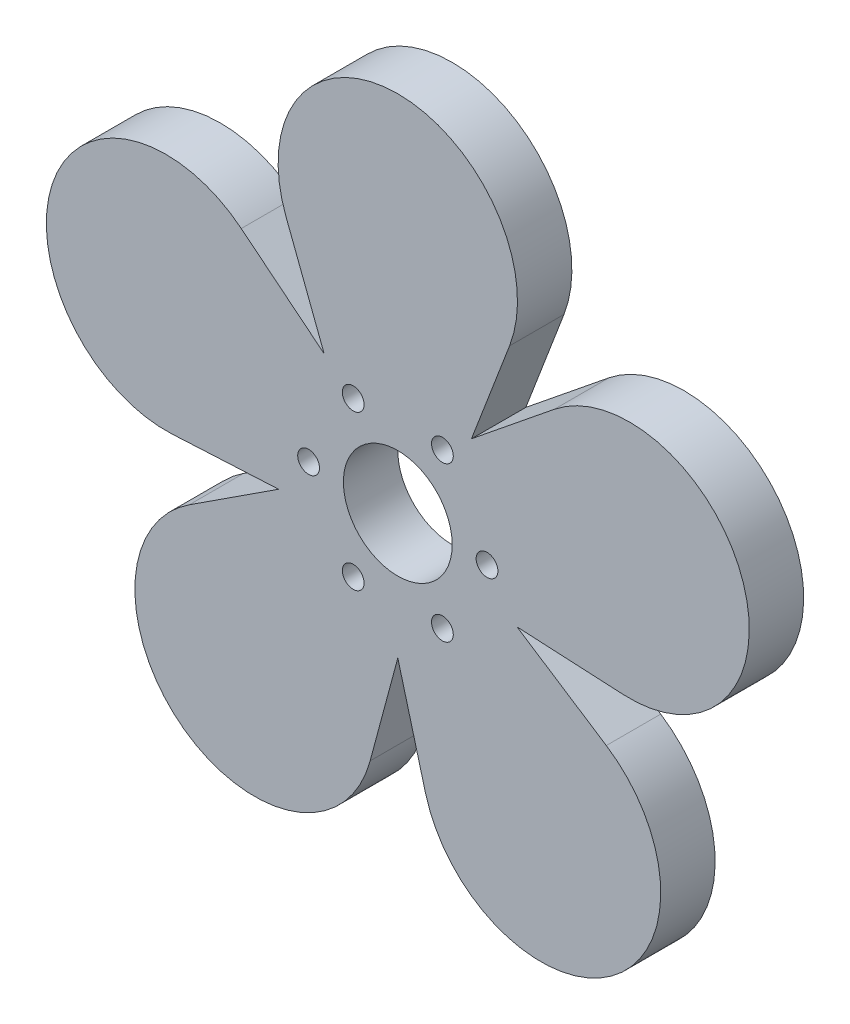
ISO-10303-21;
HEADER;
FILE_DESCRIPTION(('STEP AP214'),'2;1');
FILE_NAME('part.step','',(''),(''),'','','');
FILE_SCHEMA(('AUTOMOTIVE_DESIGN { 1 0 10303 214 1 1 1 1 }'));
ENDSEC;
DATA;
#1=APPLICATION_CONTEXT('core data for automotive mechanical design processes');
#2=APPLICATION_PROTOCOL_DEFINITION('international standard','automotive_design',2000,#1);
#3=PRODUCT_CONTEXT('',#1,'mechanical');
#4=PRODUCT('Part','Part','',(#3));
#5=PRODUCT_RELATED_PRODUCT_CATEGORY('part','',(#4));
#6=PRODUCT_DEFINITION_FORMATION('','',#4);
#7=PRODUCT_DEFINITION_CONTEXT('part definition',#1,'design');
#8=PRODUCT_DEFINITION('design','',#6,#7);
#9=PRODUCT_DEFINITION_SHAPE('','',#8);
#10=(LENGTH_UNIT() NAMED_UNIT(*) SI_UNIT(.MILLI.,.METRE.));
#11=(NAMED_UNIT(*) PLANE_ANGLE_UNIT() SI_UNIT($,.RADIAN.));
#12=(NAMED_UNIT(*) SI_UNIT($,.STERADIAN.) SOLID_ANGLE_UNIT());
#13=UNCERTAINTY_MEASURE_WITH_UNIT(LENGTH_MEASURE(1.E-05),#10,'distance_accuracy_value','');
#14=(GEOMETRIC_REPRESENTATION_CONTEXT(3) GLOBAL_UNCERTAINTY_ASSIGNED_CONTEXT((#13)) GLOBAL_UNIT_ASSIGNED_CONTEXT((#10,
#11,#12)) REPRESENTATION_CONTEXT('',''));
#15=CARTESIAN_POINT('',(0.,0.,0.));
#16=DIRECTION('',(0.,0.,1.));
#17=DIRECTION('',(1.,0.,0.));
#18=AXIS2_PLACEMENT_3D('',#15,#16,#17);
#19=CARTESIAN_POINT('',(-21.3036659650114,6.92198067399906,5.));
#20=DIRECTION('',(0.,0.,-1.));
#21=DIRECTION('',(-1.,0.,0.));
#22=AXIS2_PLACEMENT_3D('',#19,#20,#21);
#23=CYLINDRICAL_SURFACE('',#22,11.0000000000001);
#24=CARTESIAN_POINT('',(-21.3036659650114,6.92198067399906,0.));
#25=DIRECTION('',(0.,0.,1.));
#26=DIRECTION('',(1.,0.,0.));
#27=AXIS2_PLACEMENT_3D('',#24,#25,#26);
#28=CIRCLE('',#27,11.0000000000001);
#29=CARTESIAN_POINT('',(-14.3881704217572,15.4762732450555,0.));
#30=VERTEX_POINT('',#29);
#31=CARTESIAN_POINT('',(-20.7369995630569,-4.06341368346023,0.));
#32=VERTEX_POINT('',#31);
#33=EDGE_CURVE('E171',#30,#32,#28,.T.);
#34=ORIENTED_EDGE('',*,*,#33,.T.);
#35=DIRECTION('',(0.,0.,-1.));
#36=VECTOR('',#35,1.);
#37=CARTESIAN_POINT('',(-20.7369995630569,-4.06341368346023,5.));
#38=LINE('',#37,#36);
#39=CARTESIAN_POINT('',(-20.7369995630569,-4.06341368346023,5.));
#40=VERTEX_POINT('',#39);
#41=EDGE_CURVE('E11',#40,#32,#38,.T.);
#42=ORIENTED_EDGE('',*,*,#41,.F.);
#43=CARTESIAN_POINT('',(-21.3036659650114,6.92198067399906,5.));
#44=DIRECTION('',(0.,0.,1.));
#45=DIRECTION('',(1.,0.,0.));
#46=AXIS2_PLACEMENT_3D('',#43,#44,#45);
#47=CIRCLE('',#46,11.0000000000001);
#48=CARTESIAN_POINT('',(-14.3881704217572,15.4762732450555,5.));
#49=VERTEX_POINT('',#48);
#50=EDGE_CURVE('E210',#49,#40,#47,.T.);
#51=ORIENTED_EDGE('',*,*,#50,.F.);
#52=DIRECTION('',(0.,0.,-1.));
#53=VECTOR('',#52,1.);
#54=CARTESIAN_POINT('',(-14.3881704217572,15.4762732450555,5.));
#55=LINE('',#54,#53);
#56=EDGE_CURVE('E49',#49,#30,#55,.T.);
#57=ORIENTED_EDGE('',*,*,#56,.T.);
#58=EDGE_LOOP('',(#34,#42,#51,#57));
#59=FACE_BOUND('',#58,.T.);
#60=ADVANCED_FACE('F33',(#59),#23,.T.);
#61=CARTESIAN_POINT('',(-20.7369995630569,-4.06341368346023,5.));
#62=DIRECTION('',(-0.0515151274504194,0.99867221431447,0.));
#63=DIRECTION('',(-0.99867221431447,-0.0515151274504194,0.));
#64=AXIS2_PLACEMENT_3D('',#61,#62,#63);
#65=PLANE('',#64);
#66=DIRECTION('',(0.99867221431447,0.0515151274504194,0.));
#67=VECTOR('',#66,1.);
#68=CARTESIAN_POINT('',(-20.7369995630569,-4.06341368346023,0.));
#69=LINE('',#68,#67);
#70=CARTESIAN_POINT('',(-10.9525395431849,-3.55869582135045,0.));
#71=VERTEX_POINT('',#70);
#72=EDGE_CURVE('E173',#32,#71,#69,.T.);
#73=ORIENTED_EDGE('',*,*,#72,.T.);
#74=DIRECTION('',(0.,0.,-1.));
#75=VECTOR('',#74,1.);
#76=CARTESIAN_POINT('',(-10.9525395431849,-3.55869582135045,5.));
#77=LINE('',#76,#75);
#78=CARTESIAN_POINT('',(-10.9525395431849,-3.55869582135045,5.));
#79=VERTEX_POINT('',#78);
#80=EDGE_CURVE('E41',#79,#71,#77,.T.);
#81=ORIENTED_EDGE('',*,*,#80,.F.);
#82=DIRECTION('',(0.99867221431447,0.0515151274504194,0.));
#83=VECTOR('',#82,1.);
#84=CARTESIAN_POINT('',(-20.7369995630569,-4.06341368346023,5.));
#85=LINE('',#84,#83);
#86=EDGE_CURVE('E109',#40,#79,#85,.T.);
#87=ORIENTED_EDGE('',*,*,#86,.F.);
#88=ORIENTED_EDGE('',*,*,#41,.T.);
#89=EDGE_LOOP('',(#73,#81,#87,#88));
#90=FACE_BOUND('',#89,.T.);
#91=ADVANCED_FACE('F240',(#90),#65,.F.);
#92=CARTESIAN_POINT('',(-19.1649996959603,-8.90153179486492,5.));
#93=DIRECTION('',(-0.54532818587352,0.838222625375798,0.));
#94=DIRECTION('',(-0.838222625375798,-0.54532818587352,0.));
#95=AXIS2_PLACEMENT_3D('',#92,#93,#94);
#96=PLANE('',#95);
#97=DIRECTION('',(0.838222625375798,0.54532818587352,0.));
#98=VECTOR('',#97,1.);
#99=CARTESIAN_POINT('',(-19.1649996959603,-8.90153179486492,0.));
#100=LINE('',#99,#98);
#101=CARTESIAN_POINT('',(-19.1649996959603,-8.90153179486492,0.));
#102=VERTEX_POINT('',#101);
#103=EDGE_CURVE('E177',#102,#71,#100,.T.);
#104=ORIENTED_EDGE('',*,*,#103,.F.);
#105=DIRECTION('',(0.,0.,-1.));
#106=VECTOR('',#105,1.);
#107=CARTESIAN_POINT('',(-19.1649996959603,-8.90153179486492,5.));
#108=LINE('',#107,#106);
#109=CARTESIAN_POINT('',(-19.1649996959603,-8.90153179486492,5.));
#110=VERTEX_POINT('',#109);
#111=EDGE_CURVE('E233',#110,#102,#108,.T.);
#112=ORIENTED_EDGE('',*,*,#111,.F.);
#113=DIRECTION('',(0.838222625375798,0.54532818587352,0.));
#114=VECTOR('',#113,1.);
#115=CARTESIAN_POINT('',(-19.1649996959603,-8.90153179486492,5.));
#116=LINE('',#115,#114);
#117=EDGE_CURVE('E239',#110,#79,#116,.T.);
#118=ORIENTED_EDGE('',*,*,#117,.T.);
#119=ORIENTED_EDGE('',*,*,#80,.T.);
#120=EDGE_LOOP('',(#104,#112,#118,#119));
#121=FACE_BOUND('',#120,.T.);
#122=ADVANCED_FACE('F237',(#121),#96,.T.);
#123=CARTESIAN_POINT('',(-13.1663896513516,-18.1219806739987,5.));
#124=DIRECTION('',(0.,0.,-1.));
#125=DIRECTION('',(-1.,0.,0.));
#126=AXIS2_PLACEMENT_3D('',#123,#124,#125);
#127=CYLINDRICAL_SURFACE('',#126,11.);
#128=CARTESIAN_POINT('',(-13.1663896513516,-18.1219806739987,0.));
#129=DIRECTION('',(0.,0.,1.));
#130=DIRECTION('',(1.,0.,0.));
#131=AXIS2_PLACEMENT_3D('',#128,#129,#130);
#132=CIRCLE('',#131,11.);
#133=CARTESIAN_POINT('',(-2.54354921527273,-20.9777224462198,0.));
#134=VERTEX_POINT('',#133);
#135=EDGE_CURVE('E180',#102,#134,#132,.T.);
#136=ORIENTED_EDGE('',*,*,#135,.T.);
#137=DIRECTION('',(0.,0.,-1.));
#138=VECTOR('',#137,1.);
#139=CARTESIAN_POINT('',(-2.54354921527273,-20.9777224462198,5.));
#140=LINE('',#139,#138);
#141=CARTESIAN_POINT('',(-2.54354921527273,-20.9777224462198,5.));
#142=VERTEX_POINT('',#141);
#143=EDGE_CURVE('E230',#142,#134,#140,.T.);
#144=ORIENTED_EDGE('',*,*,#143,.F.);
#145=CARTESIAN_POINT('',(-13.1663896513516,-18.1219806739987,5.));
#146=DIRECTION('',(0.,0.,1.));
#147=DIRECTION('',(1.,0.,0.));
#148=AXIS2_PLACEMENT_3D('',#145,#146,#147);
#149=CIRCLE('',#148,11.);
#150=EDGE_CURVE('E258',#110,#142,#149,.T.);
#151=ORIENTED_EDGE('',*,*,#150,.F.);
#152=ORIENTED_EDGE('',*,*,#111,.T.);
#153=EDGE_LOOP('',(#136,#144,#151,#152));
#154=FACE_BOUND('',#153,.T.);
#155=ADVANCED_FACE('F248',(#154),#127,.T.);
#156=CARTESIAN_POINT('',(-2.54354921527273,-20.9777224462198,5.));
#157=DIRECTION('',(-0.965712766916251,0.259612888383759,0.));
#158=DIRECTION('',(-0.259612888383759,-0.965712766916251,0.));
#159=AXIS2_PLACEMENT_3D('',#156,#157,#158);
#160=PLANE('',#159);
#161=DIRECTION('',(0.259612888383759,0.965712766916251,0.));
#162=VECTOR('',#161,1.);
#163=CARTESIAN_POINT('',(-2.54354921527273,-20.9777224462198,0.));
#164=LINE('',#163,#162);
#165=CARTESIAN_POINT('',(1.39211558947139E-13,-11.5161815891347,0.));
#166=VERTEX_POINT('',#165);
#167=EDGE_CURVE('E182',#134,#166,#164,.T.);
#168=ORIENTED_EDGE('',*,*,#167,.T.);
#169=DIRECTION('',(0.,0.,-1.));
#170=VECTOR('',#169,1.);
#171=CARTESIAN_POINT('',(1.39211558947139E-13,-11.5161815891347,5.));
#172=LINE('',#171,#170);
#173=CARTESIAN_POINT('',(1.39211558947139E-13,-11.5161815891347,5.));
#174=VERTEX_POINT('',#173);
#175=EDGE_CURVE('E228',#174,#166,#172,.T.);
#176=ORIENTED_EDGE('',*,*,#175,.F.);
#177=DIRECTION('',(0.259612888383759,0.965712766916251,0.));
#178=VECTOR('',#177,1.);
#179=CARTESIAN_POINT('',(-2.54354921527273,-20.9777224462198,5.));
#180=LINE('',#179,#178);
#181=EDGE_CURVE('E254',#142,#174,#180,.T.);
#182=ORIENTED_EDGE('',*,*,#181,.F.);
#183=ORIENTED_EDGE('',*,*,#143,.T.);
#184=EDGE_LOOP('',(#168,#176,#182,#183));
#185=FACE_BOUND('',#184,.T.);
#186=ADVANCED_FACE('F252',(#185),#160,.F.);
#187=CARTESIAN_POINT('',(2.54354921527243,-20.9777224462199,5.));
#188=DIRECTION('',(-0.965712766916266,-0.259612888383703,0.));
#189=DIRECTION('',(0.259612888383703,-0.965712766916266,0.));
#190=AXIS2_PLACEMENT_3D('',#187,#188,#189);
#191=PLANE('',#190);
#192=DIRECTION('',(-0.259612888383703,0.965712766916266,0.));
#193=VECTOR('',#192,1.);
#194=CARTESIAN_POINT('',(2.54354921527243,-20.9777224462199,0.));
#195=LINE('',#194,#193);
#196=CARTESIAN_POINT('',(2.54354921527243,-20.9777224462198,0.));
#197=VERTEX_POINT('',#196);
#198=EDGE_CURVE('E185',#197,#166,#195,.T.);
#199=ORIENTED_EDGE('',*,*,#198,.F.);
#200=DIRECTION('',(0.,0.,-1.));
#201=VECTOR('',#200,1.);
#202=CARTESIAN_POINT('',(2.54354921527243,-20.9777224462198,5.));
#203=LINE('',#202,#201);
#204=CARTESIAN_POINT('',(2.54354921527243,-20.9777224462198,5.));
#205=VERTEX_POINT('',#204);
#206=EDGE_CURVE('E226',#205,#197,#203,.T.);
#207=ORIENTED_EDGE('',*,*,#206,.F.);
#208=DIRECTION('',(-0.259612888383703,0.965712766916266,0.));
#209=VECTOR('',#208,1.);
#210=CARTESIAN_POINT('',(2.54354921527243,-20.9777224462199,5.));
#211=LINE('',#210,#209);
#212=EDGE_CURVE('E257',#205,#174,#211,.T.);
#213=ORIENTED_EDGE('',*,*,#212,.T.);
#214=ORIENTED_EDGE('',*,*,#175,.T.);
#215=EDGE_LOOP('',(#199,#207,#213,#214));
#216=FACE_BOUND('',#215,.T.);
#217=ADVANCED_FACE('F491',(#216),#191,.T.);
#218=CARTESIAN_POINT('',(13.1663896513513,-18.1219806739989,5.));
#219=DIRECTION('',(0.,0.,-1.));
#220=DIRECTION('',(-1.,0.,0.));
#221=AXIS2_PLACEMENT_3D('',#218,#219,#220);
#222=CYLINDRICAL_SURFACE('',#221,11.);
#223=CARTESIAN_POINT('',(13.1663896513513,-18.1219806739989,0.));
#224=DIRECTION('',(0.,0.,1.));
#225=DIRECTION('',(1.,0.,0.));
#226=AXIS2_PLACEMENT_3D('',#223,#224,#225);
#227=CIRCLE('',#226,11.);
#228=CARTESIAN_POINT('',(19.1649996959602,-8.90153179486521,0.));
#229=VERTEX_POINT('',#228);
#230=EDGE_CURVE('E188',#197,#229,#227,.T.);
#231=ORIENTED_EDGE('',*,*,#230,.T.);
#232=DIRECTION('',(0.,0.,-1.));
#233=VECTOR('',#232,1.);
#234=CARTESIAN_POINT('',(19.1649996959602,-8.90153179486521,5.));
#235=LINE('',#234,#233);
#236=CARTESIAN_POINT('',(19.1649996959602,-8.90153179486521,5.));
#237=VERTEX_POINT('',#236);
#238=EDGE_CURVE('E223',#237,#229,#235,.T.);
#239=ORIENTED_EDGE('',*,*,#238,.F.);
#240=CARTESIAN_POINT('',(13.1663896513513,-18.1219806739989,5.));
#241=DIRECTION('',(0.,0.,1.));
#242=DIRECTION('',(1.,0.,0.));
#243=AXIS2_PLACEMENT_3D('',#240,#241,#242);
#244=CIRCLE('',#243,11.);
#245=EDGE_CURVE('E260',#205,#237,#244,.T.);
#246=ORIENTED_EDGE('',*,*,#245,.F.);
#247=ORIENTED_EDGE('',*,*,#206,.T.);
#248=EDGE_LOOP('',(#231,#239,#246,#247));
#249=FACE_BOUND('',#248,.T.);
#250=ADVANCED_FACE('F481',(#249),#222,.T.);
#251=CARTESIAN_POINT('',(19.1649996959602,-8.90153179486521,5.));
#252=DIRECTION('',(-0.545328185873533,-0.83822262537579,0.));
#253=DIRECTION('',(0.83822262537579,-0.545328185873533,0.));
#254=AXIS2_PLACEMENT_3D('',#251,#252,#253);
#255=PLANE('',#254);
#256=DIRECTION('',(-0.83822262537579,0.545328185873533,0.));
#257=VECTOR('',#256,1.);
#258=CARTESIAN_POINT('',(19.1649996959602,-8.90153179486521,0.));
#259=LINE('',#258,#257);
#260=CARTESIAN_POINT('',(10.9525395431843,-3.55869582135025,0.));
#261=VERTEX_POINT('',#260);
#262=EDGE_CURVE('E190',#229,#261,#259,.T.);
#263=ORIENTED_EDGE('',*,*,#262,.T.);
#264=DIRECTION('',(0.,0.,-1.));
#265=VECTOR('',#264,1.);
#266=CARTESIAN_POINT('',(10.9525395431843,-3.55869582135025,5.));
#267=LINE('',#266,#265);
#268=CARTESIAN_POINT('',(10.9525395431843,-3.55869582135025,5.));
#269=VERTEX_POINT('',#268);
#270=EDGE_CURVE('E221',#269,#261,#267,.T.);
#271=ORIENTED_EDGE('',*,*,#270,.F.);
#272=DIRECTION('',(-0.83822262537579,0.545328185873533,0.));
#273=VECTOR('',#272,1.);
#274=CARTESIAN_POINT('',(19.1649996959602,-8.90153179486521,5.));
#275=LINE('',#274,#273);
#276=EDGE_CURVE('E266',#237,#269,#275,.T.);
#277=ORIENTED_EDGE('',*,*,#276,.F.);
#278=ORIENTED_EDGE('',*,*,#238,.T.);
#279=EDGE_LOOP('',(#263,#271,#277,#278));
#280=FACE_BOUND('',#279,.T.);
#281=ADVANCED_FACE('F471',(#280),#255,.F.);
#282=CARTESIAN_POINT('',(20.7369995630568,-4.06341368346041,5.));
#283=DIRECTION('',(-0.0515151274504554,-0.998672214314468,0.));
#284=DIRECTION('',(0.998672214314469,-0.0515151274504554,0.));
#285=AXIS2_PLACEMENT_3D('',#282,#283,#284);
#286=PLANE('',#285);
#287=DIRECTION('',(-0.998672214314468,0.0515151274504554,0.));
#288=VECTOR('',#287,1.);
#289=CARTESIAN_POINT('',(20.7369995630568,-4.06341368346041,0.));
#290=LINE('',#289,#288);
#291=CARTESIAN_POINT('',(20.7369995630567,-4.06341368346041,0.));
#292=VERTEX_POINT('',#291);
#293=EDGE_CURVE('E193',#292,#261,#290,.T.);
#294=ORIENTED_EDGE('',*,*,#293,.F.);
#295=DIRECTION('',(0.,0.,-1.));
#296=VECTOR('',#295,1.);
#297=CARTESIAN_POINT('',(20.7369995630567,-4.06341368346041,5.));
#298=LINE('',#297,#296);
#299=CARTESIAN_POINT('',(20.7369995630567,-4.06341368346041,5.));
#300=VERTEX_POINT('',#299);
#301=EDGE_CURVE('E219',#300,#292,#298,.T.);
#302=ORIENTED_EDGE('',*,*,#301,.F.);
#303=DIRECTION('',(-0.998672214314468,0.0515151274504554,0.));
#304=VECTOR('',#303,1.);
#305=CARTESIAN_POINT('',(20.7369995630568,-4.06341368346041,5.));
#306=LINE('',#305,#304);
#307=EDGE_CURVE('E268',#300,#269,#306,.T.);
#308=ORIENTED_EDGE('',*,*,#307,.T.);
#309=ORIENTED_EDGE('',*,*,#270,.T.);
#310=EDGE_LOOP('',(#294,#302,#308,#309));
#311=FACE_BOUND('',#310,.T.);
#312=ADVANCED_FACE('F461',(#311),#286,.T.);
#313=CARTESIAN_POINT('',(21.3036659650115,6.92198067399876,5.));
#314=DIRECTION('',(0.,0.,-1.));
#315=DIRECTION('',(-1.,0.,0.));
#316=AXIS2_PLACEMENT_3D('',#313,#314,#315);
#317=CYLINDRICAL_SURFACE('',#316,11.);
#318=CARTESIAN_POINT('',(21.3036659650115,6.92198067399876,0.));
#319=DIRECTION('',(0.,0.,1.));
#320=DIRECTION('',(1.,0.,0.));
#321=AXIS2_PLACEMENT_3D('',#318,#319,#320);
#322=CIRCLE('',#321,11.);
#323=CARTESIAN_POINT('',(14.3881704217574,15.4762732450553,0.));
#324=VERTEX_POINT('',#323);
#325=EDGE_CURVE('E196',#292,#324,#322,.T.);
#326=ORIENTED_EDGE('',*,*,#325,.T.);
#327=DIRECTION('',(0.,0.,-1.));
#328=VECTOR('',#327,1.);
#329=CARTESIAN_POINT('',(14.3881704217574,15.4762732450553,5.));
#330=LINE('',#329,#328);
#331=CARTESIAN_POINT('',(14.3881704217574,15.4762732450553,5.));
#332=VERTEX_POINT('',#331);
#333=EDGE_CURVE('E216',#332,#324,#330,.T.);
#334=ORIENTED_EDGE('',*,*,#333,.F.);
#335=CARTESIAN_POINT('',(21.3036659650115,6.92198067399876,5.));
#336=DIRECTION('',(0.,0.,1.));
#337=DIRECTION('',(1.,0.,0.));
#338=AXIS2_PLACEMENT_3D('',#335,#336,#337);
#339=CIRCLE('',#338,11.);
#340=EDGE_CURVE('E271',#300,#332,#339,.T.);
#341=ORIENTED_EDGE('',*,*,#340,.F.);
#342=ORIENTED_EDGE('',*,*,#301,.T.);
#343=EDGE_LOOP('',(#326,#334,#341,#342));
#344=FACE_BOUND('',#343,.T.);
#345=ADVANCED_FACE('F451',(#344),#317,.T.);
#346=CARTESIAN_POINT('',(14.3881704217574,15.4762732450553,5.));
#347=DIRECTION('',(0.628681413023097,-0.777662961005141,0.));
#348=DIRECTION('',(0.777662961005141,0.628681413023097,0.));
#349=AXIS2_PLACEMENT_3D('',#346,#347,#348);
#350=PLANE('',#349);
#351=DIRECTION('',(-0.777662961005141,-0.628681413023097,0.));
#352=VECTOR('',#351,1.);
#353=CARTESIAN_POINT('',(14.3881704217574,15.4762732450553,0.));
#354=LINE('',#353,#352);
#355=CARTESIAN_POINT('',(6.76904170081545,9.31678661591781,0.));
#356=VERTEX_POINT('',#355);
#357=EDGE_CURVE('E198',#324,#356,#354,.T.);
#358=ORIENTED_EDGE('',*,*,#357,.T.);
#359=DIRECTION('',(0.,0.,-1.));
#360=VECTOR('',#359,1.);
#361=CARTESIAN_POINT('',(6.76904170081545,9.31678661591781,5.));
#362=LINE('',#361,#360);
#363=CARTESIAN_POINT('',(6.76904170081545,9.31678661591781,5.));
#364=VERTEX_POINT('',#363);
#365=EDGE_CURVE('E214',#364,#356,#362,.T.);
#366=ORIENTED_EDGE('',*,*,#365,.F.);
#367=DIRECTION('',(-0.777662961005141,-0.628681413023097,0.));
#368=VECTOR('',#367,1.);
#369=CARTESIAN_POINT('',(14.3881704217574,15.4762732450553,5.));
#370=LINE('',#369,#368);
#371=EDGE_CURVE('E273',#332,#364,#370,.T.);
#372=ORIENTED_EDGE('',*,*,#371,.F.);
#373=ORIENTED_EDGE('',*,*,#333,.T.);
#374=EDGE_LOOP('',(#358,#366,#372,#373));
#375=FACE_BOUND('',#374,.T.);
#376=ADVANCED_FACE('F442',(#375),#350,.F.);
#377=CARTESIAN_POINT('',(10.2726213393883,18.4663946794899,5.));
#378=DIRECTION('',(0.933874667217114,-0.357600483682734,0.));
#379=DIRECTION('',(0.357600483682734,0.933874667217114,0.));
#380=AXIS2_PLACEMENT_3D('',#377,#378,#379);
#381=PLANE('',#380);
#382=DIRECTION('',(-0.357600483682734,-0.933874667217114,0.));
#383=VECTOR('',#382,1.);
#384=CARTESIAN_POINT('',(10.2726213393883,18.4663946794899,0.));
#385=LINE('',#384,#383);
#386=CARTESIAN_POINT('',(10.2726213393883,18.4663946794899,0.));
#387=VERTEX_POINT('',#386);
#388=EDGE_CURVE('E201',#387,#356,#385,.T.);
#389=ORIENTED_EDGE('',*,*,#388,.F.);
#390=DIRECTION('',(0.,0.,-1.));
#391=VECTOR('',#390,1.);
#392=CARTESIAN_POINT('',(10.2726213393883,18.4663946794899,5.));
#393=LINE('',#392,#391);
#394=CARTESIAN_POINT('',(10.2726213393883,18.4663946794899,5.));
#395=VERTEX_POINT('',#394);
#396=EDGE_CURVE('E163',#395,#387,#393,.T.);
#397=ORIENTED_EDGE('',*,*,#396,.F.);
#398=DIRECTION('',(-0.357600483682734,-0.933874667217114,0.));
#399=VECTOR('',#398,1.);
#400=CARTESIAN_POINT('',(10.2726213393883,18.4663946794899,5.));
#401=LINE('',#400,#399);
#402=EDGE_CURVE('E153',#395,#364,#401,.T.);
#403=ORIENTED_EDGE('',*,*,#402,.T.);
#404=ORIENTED_EDGE('',*,*,#365,.T.);
#405=EDGE_LOOP('',(#389,#397,#403,#404));
#406=FACE_BOUND('',#405,.T.);
#407=ADVANCED_FACE('F276',(#406),#381,.T.);
#408=CARTESIAN_POINT('',(0.,22.4,5.));
#409=DIRECTION('',(0.,0.,-1.));
#410=DIRECTION('',(-1.,0.,0.));
#411=AXIS2_PLACEMENT_3D('',#408,#409,#410);
#412=CYLINDRICAL_SURFACE('',#411,11.);
#413=CARTESIAN_POINT('',(0.,22.4,0.));
#414=DIRECTION('',(0.,0.,1.));
#415=DIRECTION('',(1.,0.,0.));
#416=AXIS2_PLACEMENT_3D('',#413,#414,#415);
#417=CIRCLE('',#416,11.);
#418=CARTESIAN_POINT('',(-10.2726213393883,18.4663946794899,0.));
#419=VERTEX_POINT('',#418);
#420=EDGE_CURVE('E160',#387,#419,#417,.T.);
#421=ORIENTED_EDGE('',*,*,#420,.T.);
#422=DIRECTION('',(0.,0.,-1.));
#423=VECTOR('',#422,1.);
#424=CARTESIAN_POINT('',(-10.2726213393883,18.4663946794899,5.));
#425=LINE('',#424,#423);
#426=CARTESIAN_POINT('',(-10.2726213393883,18.4663946794899,5.));
#427=VERTEX_POINT('',#426);
#428=EDGE_CURVE('E157',#427,#419,#425,.T.);
#429=ORIENTED_EDGE('',*,*,#428,.F.);
#430=CARTESIAN_POINT('',(0.,22.4,5.));
#431=DIRECTION('',(0.,0.,1.));
#432=DIRECTION('',(1.,0.,0.));
#433=AXIS2_PLACEMENT_3D('',#430,#431,#432);
#434=CIRCLE('',#433,11.);
#435=EDGE_CURVE('E146',#395,#427,#434,.T.);
#436=ORIENTED_EDGE('',*,*,#435,.F.);
#437=ORIENTED_EDGE('',*,*,#396,.T.);
#438=EDGE_LOOP('',(#421,#429,#436,#437));
#439=FACE_BOUND('',#438,.T.);
#440=ADVANCED_FACE('F158',(#439),#412,.T.);
#441=CARTESIAN_POINT('',(-10.2726213393883,18.4663946794899,5.));
#442=DIRECTION('',(0.933874667217116,0.357600483682728,0.));
#443=DIRECTION('',(-0.357600483682728,0.933874667217116,0.));
#444=AXIS2_PLACEMENT_3D('',#441,#442,#443);
#445=PLANE('',#444);
#446=DIRECTION('',(0.357600483682728,-0.933874667217116,0.));
#447=VECTOR('',#446,1.);
#448=CARTESIAN_POINT('',(-10.2726213393883,18.4663946794899,0.));
#449=LINE('',#448,#447);
#450=CARTESIAN_POINT('',(-6.76904170081566,9.31678661591819,0.));
#451=VERTEX_POINT('',#450);
#452=EDGE_CURVE('E205',#419,#451,#449,.T.);
#453=ORIENTED_EDGE('',*,*,#452,.T.);
#454=DIRECTION('',(0.,0.,-1.));
#455=VECTOR('',#454,1.);
#456=CARTESIAN_POINT('',(-6.76904170081566,9.31678661591819,5.));
#457=LINE('',#456,#455);
#458=CARTESIAN_POINT('',(-6.76904170081566,9.31678661591819,5.));
#459=VERTEX_POINT('',#458);
#460=EDGE_CURVE('E97',#459,#451,#457,.T.);
#461=ORIENTED_EDGE('',*,*,#460,.F.);
#462=DIRECTION('',(0.357600483682728,-0.933874667217116,0.));
#463=VECTOR('',#462,1.);
#464=CARTESIAN_POINT('',(-10.2726213393883,18.4663946794899,5.));
#465=LINE('',#464,#463);
#466=EDGE_CURVE('E151',#427,#459,#465,.T.);
#467=ORIENTED_EDGE('',*,*,#466,.F.);
#468=ORIENTED_EDGE('',*,*,#428,.T.);
#469=EDGE_LOOP('',(#453,#461,#467,#468));
#470=FACE_BOUND('',#469,.T.);
#471=ADVANCED_FACE('F165',(#470),#445,.F.);
#472=CARTESIAN_POINT('',(-14.3881704217572,15.4762732450555,5.));
#473=DIRECTION('',(0.628681413023107,0.777662961005132,0.));
#474=DIRECTION('',(-0.777662961005133,0.628681413023107,0.));
#475=AXIS2_PLACEMENT_3D('',#472,#473,#474);
#476=PLANE('',#475);
#477=DIRECTION('',(0.777662961005132,-0.628681413023107,0.));
#478=VECTOR('',#477,1.);
#479=CARTESIAN_POINT('',(-14.3881704217572,15.4762732450555,0.));
#480=LINE('',#479,#478);
#481=EDGE_CURVE('E207',#30,#451,#480,.T.);
#482=ORIENTED_EDGE('',*,*,#481,.F.);
#483=ORIENTED_EDGE('',*,*,#56,.F.);
#484=DIRECTION('',(0.777662961005132,-0.628681413023107,0.));
#485=VECTOR('',#484,1.);
#486=CARTESIAN_POINT('',(-14.3881704217572,15.4762732450555,5.));
#487=LINE('',#486,#485);
#488=EDGE_CURVE('E166',#49,#459,#487,.T.);
#489=ORIENTED_EDGE('',*,*,#488,.T.);
#490=ORIENTED_EDGE('',*,*,#460,.T.);
#491=EDGE_LOOP('',(#482,#483,#489,#490));
#492=FACE_BOUND('',#491,.T.);
#493=ADVANCED_FACE('F279',(#492),#476,.T.);
#494=CARTESIAN_POINT('',(-21.3036659650114,6.92198067399906,5.));
#495=DIRECTION('',(0.,0.,1.));
#496=DIRECTION('',(1.,0.,0.));
#497=AXIS2_PLACEMENT_3D('',#494,#495,#496);
#498=PLANE('',#497);
#499=CARTESIAN_POINT('',(0.,0.,5.));
#500=DIRECTION('',(0.,0.,1.));
#501=DIRECTION('',(1.,0.,0.));
#502=AXIS2_PLACEMENT_3D('',#499,#500,#501);
#503=CIRCLE('',#502,5.);
#504=CARTESIAN_POINT('',(5.,0.,5.));
#505=VERTEX_POINT('',#504);
#506=EDGE_CURVE('E307',#505,#505,#503,.T.);
#507=ORIENTED_EDGE('',*,*,#506,.F.);
#508=EDGE_LOOP('',(#507));
#509=FACE_BOUND('',#508,.T.);
#510=CARTESIAN_POINT('',(4.09999999999998,-7.10140831103241,5.));
#511=DIRECTION('',(0.,0.,1.));
#512=DIRECTION('',(1.,0.,0.));
#513=AXIS2_PLACEMENT_3D('',#510,#511,#512);
#514=CIRCLE('',#513,1.);
#515=CARTESIAN_POINT('',(5.09999999999998,-7.10140831103241,5.));
#516=VERTEX_POINT('',#515);
#517=EDGE_CURVE('E328',#516,#516,#514,.T.);
#518=ORIENTED_EDGE('',*,*,#517,.F.);
#519=EDGE_LOOP('',(#518));
#520=FACE_BOUND('',#519,.T.);
#521=CARTESIAN_POINT('',(-4.10000000000003,-7.10140831103238,5.));
#522=DIRECTION('',(0.,0.,1.));
#523=DIRECTION('',(1.,0.,0.));
#524=AXIS2_PLACEMENT_3D('',#521,#522,#523);
#525=CIRCLE('',#524,1.);
#526=CARTESIAN_POINT('',(-3.10000000000003,-7.10140831103238,5.));
#527=VERTEX_POINT('',#526);
#528=EDGE_CURVE('E322',#527,#527,#525,.T.);
#529=ORIENTED_EDGE('',*,*,#528,.F.);
#530=EDGE_LOOP('',(#529));
#531=FACE_BOUND('',#530,.T.);
#532=CARTESIAN_POINT('',(-8.2,0.,5.));
#533=DIRECTION('',(0.,0.,1.));
#534=DIRECTION('',(1.,0.,0.));
#535=AXIS2_PLACEMENT_3D('',#532,#533,#534);
#536=CIRCLE('',#535,1.);
#537=CARTESIAN_POINT('',(-7.2,0.,5.));
#538=VERTEX_POINT('',#537);
#539=EDGE_CURVE('E316',#538,#538,#536,.T.);
#540=ORIENTED_EDGE('',*,*,#539,.F.);
#541=EDGE_LOOP('',(#540));
#542=FACE_BOUND('',#541,.T.);
#543=CARTESIAN_POINT('',(-4.09999999999993,7.10140831103243,5.));
#544=DIRECTION('',(0.,0.,1.));
#545=DIRECTION('',(1.,0.,0.));
#546=AXIS2_PLACEMENT_3D('',#543,#544,#545);
#547=CIRCLE('',#546,1.);
#548=CARTESIAN_POINT('',(-3.09999999999993,7.10140831103243,5.));
#549=VERTEX_POINT('',#548);
#550=EDGE_CURVE('E310',#549,#549,#547,.T.);
#551=ORIENTED_EDGE('',*,*,#550,.F.);
#552=EDGE_LOOP('',(#551));
#553=FACE_BOUND('',#552,.T.);
#554=CARTESIAN_POINT('',(4.10000000000008,7.10140831103235,5.));
#555=DIRECTION('',(0.,0.,1.));
#556=DIRECTION('',(1.,0.,0.));
#557=AXIS2_PLACEMENT_3D('',#554,#555,#556);
#558=CIRCLE('',#557,1.);
#559=CARTESIAN_POINT('',(5.10000000000008,7.10140831103235,5.));
#560=VERTEX_POINT('',#559);
#561=EDGE_CURVE('E303',#560,#560,#558,.T.);
#562=ORIENTED_EDGE('',*,*,#561,.F.);
#563=EDGE_LOOP('',(#562));
#564=FACE_BOUND('',#563,.T.);
#565=CARTESIAN_POINT('',(8.2,0.,5.));
#566=DIRECTION('',(0.,0.,1.));
#567=DIRECTION('',(1.,0.,0.));
#568=AXIS2_PLACEMENT_3D('',#565,#566,#567);
#569=CIRCLE('',#568,1.);
#570=CARTESIAN_POINT('',(9.2,0.,5.));
#571=VERTEX_POINT('',#570);
#572=EDGE_CURVE('E297',#571,#571,#569,.T.);
#573=ORIENTED_EDGE('',*,*,#572,.F.);
#574=EDGE_LOOP('',(#573));
#575=FACE_BOUND('',#574,.T.);
#576=ORIENTED_EDGE('',*,*,#50,.T.);
#577=ORIENTED_EDGE('',*,*,#86,.T.);
#578=ORIENTED_EDGE('',*,*,#117,.F.);
#579=ORIENTED_EDGE('',*,*,#150,.T.);
#580=ORIENTED_EDGE('',*,*,#181,.T.);
#581=ORIENTED_EDGE('',*,*,#212,.F.);
#582=ORIENTED_EDGE('',*,*,#245,.T.);
#583=ORIENTED_EDGE('',*,*,#276,.T.);
#584=ORIENTED_EDGE('',*,*,#307,.F.);
#585=ORIENTED_EDGE('',*,*,#340,.T.);
#586=ORIENTED_EDGE('',*,*,#371,.T.);
#587=ORIENTED_EDGE('',*,*,#402,.F.);
#588=ORIENTED_EDGE('',*,*,#435,.T.);
#589=ORIENTED_EDGE('',*,*,#466,.T.);
#590=ORIENTED_EDGE('',*,*,#488,.F.);
#591=EDGE_LOOP('',(#576,#577,#578,#579,#580,#581,#582,#583,#584,#585,#586,#587,#588,#589,#590));
#592=FACE_BOUND('',#591,.T.);
#593=ADVANCED_FACE('F148',(#509,#520,#531,#542,#553,#564,#575,#592),#498,.T.);
#594=CARTESIAN_POINT('',(-21.3036659650114,6.92198067399906,0.));
#595=DIRECTION('',(0.,0.,1.));
#596=DIRECTION('',(1.,0.,0.));
#597=AXIS2_PLACEMENT_3D('',#594,#595,#596);
#598=PLANE('',#597);
#599=CARTESIAN_POINT('',(0.,0.,0.));
#600=DIRECTION('',(0.,0.,1.));
#601=DIRECTION('',(1.,0.,0.));
#602=AXIS2_PLACEMENT_3D('',#599,#600,#601);
#603=CIRCLE('',#602,5.);
#604=CARTESIAN_POINT('',(5.,0.,0.));
#605=VERTEX_POINT('',#604);
#606=EDGE_CURVE('E333',#605,#605,#603,.T.);
#607=ORIENTED_EDGE('',*,*,#606,.T.);
#608=EDGE_LOOP('',(#607));
#609=FACE_BOUND('',#608,.T.);
#610=CARTESIAN_POINT('',(4.09999999999998,-7.10140831103241,0.));
#611=DIRECTION('',(0.,0.,1.));
#612=DIRECTION('',(1.,0.,0.));
#613=AXIS2_PLACEMENT_3D('',#610,#611,#612);
#614=CIRCLE('',#613,1.);
#615=CARTESIAN_POINT('',(5.09999999999998,-7.10140831103241,0.));
#616=VERTEX_POINT('',#615);
#617=EDGE_CURVE('E300',#616,#616,#614,.T.);
#618=ORIENTED_EDGE('',*,*,#617,.T.);
#619=EDGE_LOOP('',(#618));
#620=FACE_BOUND('',#619,.T.);
#621=CARTESIAN_POINT('',(-4.10000000000003,-7.10140831103238,0.));
#622=DIRECTION('',(0.,0.,1.));
#623=DIRECTION('',(1.,0.,0.));
#624=AXIS2_PLACEMENT_3D('',#621,#622,#623);
#625=CIRCLE('',#624,1.);
#626=CARTESIAN_POINT('',(-3.10000000000003,-7.10140831103238,0.));
#627=VERTEX_POINT('',#626);
#628=EDGE_CURVE('E325',#627,#627,#625,.T.);
#629=ORIENTED_EDGE('',*,*,#628,.T.);
#630=EDGE_LOOP('',(#629));
#631=FACE_BOUND('',#630,.T.);
#632=CARTESIAN_POINT('',(-8.2,0.,0.));
#633=DIRECTION('',(0.,0.,1.));
#634=DIRECTION('',(1.,0.,0.));
#635=AXIS2_PLACEMENT_3D('',#632,#633,#634);
#636=CIRCLE('',#635,1.);
#637=CARTESIAN_POINT('',(-7.2,0.,0.));
#638=VERTEX_POINT('',#637);
#639=EDGE_CURVE('E319',#638,#638,#636,.T.);
#640=ORIENTED_EDGE('',*,*,#639,.T.);
#641=EDGE_LOOP('',(#640));
#642=FACE_BOUND('',#641,.T.);
#643=CARTESIAN_POINT('',(-4.09999999999993,7.10140831103243,0.));
#644=DIRECTION('',(0.,0.,1.));
#645=DIRECTION('',(1.,0.,0.));
#646=AXIS2_PLACEMENT_3D('',#643,#644,#645);
#647=CIRCLE('',#646,1.);
#648=CARTESIAN_POINT('',(-3.09999999999993,7.10140831103243,0.));
#649=VERTEX_POINT('',#648);
#650=EDGE_CURVE('E313',#649,#649,#647,.T.);
#651=ORIENTED_EDGE('',*,*,#650,.T.);
#652=EDGE_LOOP('',(#651));
#653=FACE_BOUND('',#652,.T.);
#654=CARTESIAN_POINT('',(4.10000000000008,7.10140831103235,0.));
#655=DIRECTION('',(0.,0.,1.));
#656=DIRECTION('',(1.,0.,0.));
#657=AXIS2_PLACEMENT_3D('',#654,#655,#656);
#658=CIRCLE('',#657,1.);
#659=CARTESIAN_POINT('',(5.10000000000008,7.10140831103235,0.));
#660=VERTEX_POINT('',#659);
#661=EDGE_CURVE('E306',#660,#660,#658,.T.);
#662=ORIENTED_EDGE('',*,*,#661,.T.);
#663=EDGE_LOOP('',(#662));
#664=FACE_BOUND('',#663,.T.);
#665=CARTESIAN_POINT('',(8.2,0.,0.));
#666=DIRECTION('',(0.,0.,1.));
#667=DIRECTION('',(1.,0.,0.));
#668=AXIS2_PLACEMENT_3D('',#665,#666,#667);
#669=CIRCLE('',#668,1.);
#670=CARTESIAN_POINT('',(9.2,0.,0.));
#671=VERTEX_POINT('',#670);
#672=EDGE_CURVE('E174',#671,#671,#669,.T.);
#673=ORIENTED_EDGE('',*,*,#672,.T.);
#674=EDGE_LOOP('',(#673));
#675=FACE_BOUND('',#674,.T.);
#676=ORIENTED_EDGE('',*,*,#33,.F.);
#677=ORIENTED_EDGE('',*,*,#481,.T.);
#678=ORIENTED_EDGE('',*,*,#452,.F.);
#679=ORIENTED_EDGE('',*,*,#420,.F.);
#680=ORIENTED_EDGE('',*,*,#388,.T.);
#681=ORIENTED_EDGE('',*,*,#357,.F.);
#682=ORIENTED_EDGE('',*,*,#325,.F.);
#683=ORIENTED_EDGE('',*,*,#293,.T.);
#684=ORIENTED_EDGE('',*,*,#262,.F.);
#685=ORIENTED_EDGE('',*,*,#230,.F.);
#686=ORIENTED_EDGE('',*,*,#198,.T.);
#687=ORIENTED_EDGE('',*,*,#167,.F.);
#688=ORIENTED_EDGE('',*,*,#135,.F.);
#689=ORIENTED_EDGE('',*,*,#103,.T.);
#690=ORIENTED_EDGE('',*,*,#72,.F.);
#691=EDGE_LOOP('',(#676,#677,#678,#679,#680,#681,#682,#683,#684,#685,#686,#687,#688,#689,#690));
#692=FACE_BOUND('',#691,.T.);
#693=ADVANCED_FACE('F244',(#609,#620,#631,#642,#653,#664,#675,#692),#598,.F.);
#694=CARTESIAN_POINT('',(8.2,0.,0.));
#695=DIRECTION('',(0.,0.,1.));
#696=DIRECTION('',(1.,0.,0.));
#697=AXIS2_PLACEMENT_3D('',#694,#695,#696);
#698=CYLINDRICAL_SURFACE('',#697,1.);
#699=ORIENTED_EDGE('',*,*,#672,.F.);
#700=EDGE_LOOP('',(#699));
#701=FACE_BOUND('',#700,.T.);
#702=ORIENTED_EDGE('',*,*,#572,.T.);
#703=EDGE_LOOP('',(#702));
#704=FACE_BOUND('',#703,.T.);
#705=ADVANCED_FACE('F354',(#701,#704),#698,.F.);
#706=CARTESIAN_POINT('',(4.10000000000008,7.10140831103235,0.));
#707=DIRECTION('',(0.,0.,1.));
#708=DIRECTION('',(1.,0.,0.));
#709=AXIS2_PLACEMENT_3D('',#706,#707,#708);
#710=CYLINDRICAL_SURFACE('',#709,1.);
#711=ORIENTED_EDGE('',*,*,#661,.F.);
#712=EDGE_LOOP('',(#711));
#713=FACE_BOUND('',#712,.T.);
#714=ORIENTED_EDGE('',*,*,#561,.T.);
#715=EDGE_LOOP('',(#714));
#716=FACE_BOUND('',#715,.T.);
#717=ADVANCED_FACE('F356',(#713,#716),#710,.F.);
#718=CARTESIAN_POINT('',(-4.09999999999993,7.10140831103243,0.));
#719=DIRECTION('',(0.,0.,1.));
#720=DIRECTION('',(1.,0.,0.));
#721=AXIS2_PLACEMENT_3D('',#718,#719,#720);
#722=CYLINDRICAL_SURFACE('',#721,1.);
#723=ORIENTED_EDGE('',*,*,#650,.F.);
#724=EDGE_LOOP('',(#723));
#725=FACE_BOUND('',#724,.T.);
#726=ORIENTED_EDGE('',*,*,#550,.T.);
#727=EDGE_LOOP('',(#726));
#728=FACE_BOUND('',#727,.T.);
#729=ADVANCED_FACE('F363',(#725,#728),#722,.F.);
#730=CARTESIAN_POINT('',(-8.2,0.,0.));
#731=DIRECTION('',(0.,0.,1.));
#732=DIRECTION('',(1.,0.,0.));
#733=AXIS2_PLACEMENT_3D('',#730,#731,#732);
#734=CYLINDRICAL_SURFACE('',#733,1.);
#735=ORIENTED_EDGE('',*,*,#639,.F.);
#736=EDGE_LOOP('',(#735));
#737=FACE_BOUND('',#736,.T.);
#738=ORIENTED_EDGE('',*,*,#539,.T.);
#739=EDGE_LOOP('',(#738));
#740=FACE_BOUND('',#739,.T.);
#741=ADVANCED_FACE('F371',(#737,#740),#734,.F.);
#742=CARTESIAN_POINT('',(-4.10000000000003,-7.10140831103238,0.));
#743=DIRECTION('',(0.,0.,1.));
#744=DIRECTION('',(1.,0.,0.));
#745=AXIS2_PLACEMENT_3D('',#742,#743,#744);
#746=CYLINDRICAL_SURFACE('',#745,1.);
#747=ORIENTED_EDGE('',*,*,#628,.F.);
#748=EDGE_LOOP('',(#747));
#749=FACE_BOUND('',#748,.T.);
#750=ORIENTED_EDGE('',*,*,#528,.T.);
#751=EDGE_LOOP('',(#750));
#752=FACE_BOUND('',#751,.T.);
#753=ADVANCED_FACE('F375',(#749,#752),#746,.F.);
#754=CARTESIAN_POINT('',(4.09999999999998,-7.10140831103241,0.));
#755=DIRECTION('',(0.,0.,1.));
#756=DIRECTION('',(1.,0.,0.));
#757=AXIS2_PLACEMENT_3D('',#754,#755,#756);
#758=CYLINDRICAL_SURFACE('',#757,1.);
#759=ORIENTED_EDGE('',*,*,#617,.F.);
#760=EDGE_LOOP('',(#759));
#761=FACE_BOUND('',#760,.T.);
#762=ORIENTED_EDGE('',*,*,#517,.T.);
#763=EDGE_LOOP('',(#762));
#764=FACE_BOUND('',#763,.T.);
#765=ADVANCED_FACE('F379',(#761,#764),#758,.F.);
#766=CARTESIAN_POINT('',(0.,0.,5.));
#767=DIRECTION('',(0.,0.,-1.));
#768=DIRECTION('',(-1.,0.,0.));
#769=AXIS2_PLACEMENT_3D('',#766,#767,#768);
#770=CYLINDRICAL_SURFACE('',#769,5.);
#771=ORIENTED_EDGE('',*,*,#506,.T.);
#772=EDGE_LOOP('',(#771));
#773=FACE_BOUND('',#772,.T.);
#774=ORIENTED_EDGE('',*,*,#606,.F.);
#775=EDGE_LOOP('',(#774));
#776=FACE_BOUND('',#775,.T.);
#777=ADVANCED_FACE('F339',(#773,#776),#770,.F.);
#778=CLOSED_SHELL('',(#60,#91,#122,#155,#186,#217,#250,#281,#312,#345,#376,#407,#440,#471,#493,
#593,#693,#705,#717,#729,#741,#753,#765,#777));
#779=MANIFOLD_SOLID_BREP('B2',#778);
#780=ADVANCED_BREP_SHAPE_REPRESENTATION('',(#18,#779),#14);
#781=SHAPE_DEFINITION_REPRESENTATION(#9,#780);
ENDSEC;
END-ISO-10303-21;
